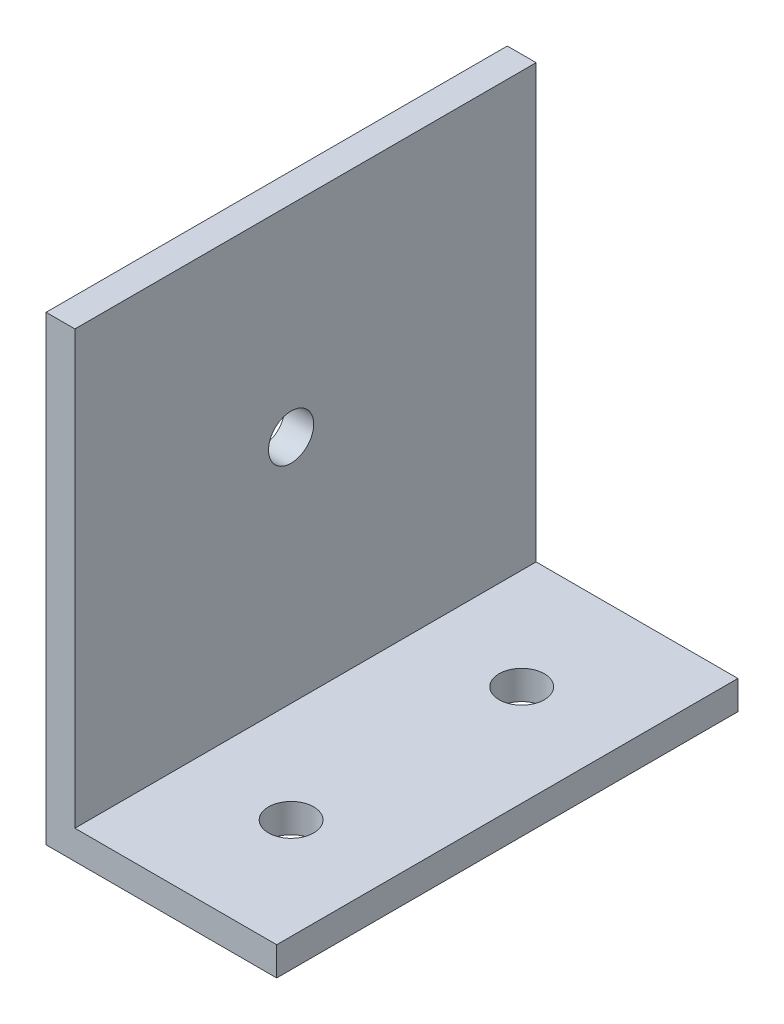
ISO-10303-21;
HEADER;
FILE_DESCRIPTION(('STEP AP214'),'2;1');
FILE_NAME('part.step','',(''),(''),'','','');
FILE_SCHEMA(('AUTOMOTIVE_DESIGN { 1 0 10303 214 1 1 1 1 }'));
ENDSEC;
DATA;
#1=APPLICATION_CONTEXT('core data for automotive mechanical design processes');
#2=APPLICATION_PROTOCOL_DEFINITION('international standard','automotive_design',2000,#1);
#3=PRODUCT_CONTEXT('',#1,'mechanical');
#4=PRODUCT('Part','Part','',(#3));
#5=PRODUCT_RELATED_PRODUCT_CATEGORY('part','',(#4));
#6=PRODUCT_DEFINITION_FORMATION('','',#4);
#7=PRODUCT_DEFINITION_CONTEXT('part definition',#1,'design');
#8=PRODUCT_DEFINITION('design','',#6,#7);
#9=PRODUCT_DEFINITION_SHAPE('','',#8);
#10=(LENGTH_UNIT() NAMED_UNIT(*) SI_UNIT(.MILLI.,.METRE.));
#11=(NAMED_UNIT(*) PLANE_ANGLE_UNIT() SI_UNIT($,.RADIAN.));
#12=(NAMED_UNIT(*) SI_UNIT($,.STERADIAN.) SOLID_ANGLE_UNIT());
#13=UNCERTAINTY_MEASURE_WITH_UNIT(LENGTH_MEASURE(1.E-05),#10,'distance_accuracy_value','');
#14=(GEOMETRIC_REPRESENTATION_CONTEXT(3) GLOBAL_UNCERTAINTY_ASSIGNED_CONTEXT((#13)) GLOBAL_UNIT_ASSIGNED_CONTEXT((#10,
#11,#12)) REPRESENTATION_CONTEXT('',''));
#15=CARTESIAN_POINT('',(0.,0.,0.));
#16=DIRECTION('',(0.,0.,1.));
#17=DIRECTION('',(1.,0.,0.));
#18=AXIS2_PLACEMENT_3D('',#15,#16,#17);
#19=CARTESIAN_POINT('',(25.4,0.,50.8));
#20=DIRECTION('',(0.,1.,0.));
#21=DIRECTION('',(-1.,0.,0.));
#22=AXIS2_PLACEMENT_3D('',#19,#20,#21);
#23=PLANE('',#22);
#24=CARTESIAN_POINT('',(14.2875,0.,38.1));
#25=DIRECTION('',(0.,1.,0.));
#26=DIRECTION('',(0.,0.,1.));
#27=AXIS2_PLACEMENT_3D('',#24,#25,#26);
#28=CIRCLE('',#27,2.4892);
#29=CARTESIAN_POINT('',(14.2875,0.,40.5892));
#30=VERTEX_POINT('',#29);
#31=EDGE_CURVE('E165',#30,#30,#28,.T.);
#32=ORIENTED_EDGE('',*,*,#31,.T.);
#33=EDGE_LOOP('',(#32));
#34=FACE_BOUND('',#33,.T.);
#35=CARTESIAN_POINT('',(14.2875,0.,12.7));
#36=DIRECTION('',(0.,1.,0.));
#37=DIRECTION('',(0.,0.,1.));
#38=AXIS2_PLACEMENT_3D('',#35,#36,#37);
#39=CIRCLE('',#38,2.4892);
#40=CARTESIAN_POINT('',(14.2875,0.,15.1892));
#41=VERTEX_POINT('',#40);
#42=EDGE_CURVE('E173',#41,#41,#39,.T.);
#43=ORIENTED_EDGE('',*,*,#42,.T.);
#44=EDGE_LOOP('',(#43));
#45=FACE_BOUND('',#44,.T.);
#46=DIRECTION('',(1.,0.,0.));
#47=VECTOR('',#46,1.);
#48=CARTESIAN_POINT('',(25.4,0.,0.));
#49=LINE('',#48,#47);
#50=CARTESIAN_POINT('',(0.,0.,0.));
#51=VERTEX_POINT('',#50);
#52=CARTESIAN_POINT('',(25.4,0.,0.));
#53=VERTEX_POINT('',#52);
#54=EDGE_CURVE('E136',#51,#53,#49,.T.);
#55=ORIENTED_EDGE('',*,*,#54,.T.);
#56=DIRECTION('',(0.,0.,-1.));
#57=VECTOR('',#56,1.);
#58=CARTESIAN_POINT('',(25.4,0.,50.8));
#59=LINE('',#58,#57);
#60=CARTESIAN_POINT('',(25.4,0.,50.8));
#61=VERTEX_POINT('',#60);
#62=EDGE_CURVE('E11',#61,#53,#59,.T.);
#63=ORIENTED_EDGE('',*,*,#62,.F.);
#64=DIRECTION('',(1.,0.,0.));
#65=VECTOR('',#64,1.);
#66=CARTESIAN_POINT('',(25.4,0.,50.8));
#67=LINE('',#66,#65);
#68=CARTESIAN_POINT('',(0.,0.,50.8));
#69=VERTEX_POINT('',#68);
#70=EDGE_CURVE('E153',#69,#61,#67,.T.);
#71=ORIENTED_EDGE('',*,*,#70,.F.);
#72=DIRECTION('',(0.,0.,-1.));
#73=VECTOR('',#72,1.);
#74=CARTESIAN_POINT('',(0.,0.,50.8));
#75=LINE('',#74,#73);
#76=EDGE_CURVE('E132',#69,#51,#75,.T.);
#77=ORIENTED_EDGE('',*,*,#76,.T.);
#78=EDGE_LOOP('',(#55,#63,#71,#77));
#79=FACE_BOUND('',#78,.T.);
#80=ADVANCED_FACE('F45',(#34,#45,#79),#23,.F.);
#81=CARTESIAN_POINT('',(25.4,3.175,50.8));
#82=DIRECTION('',(-1.,0.,0.));
#83=DIRECTION('',(0.,0.,1.));
#84=AXIS2_PLACEMENT_3D('',#81,#82,#83);
#85=PLANE('',#84);
#86=DIRECTION('',(0.,1.,0.));
#87=VECTOR('',#86,1.);
#88=CARTESIAN_POINT('',(25.4,3.175,0.));
#89=LINE('',#88,#87);
#90=CARTESIAN_POINT('',(25.4,3.175,0.));
#91=VERTEX_POINT('',#90);
#92=EDGE_CURVE('E140',#53,#91,#89,.T.);
#93=ORIENTED_EDGE('',*,*,#92,.T.);
#94=DIRECTION('',(0.,0.,-1.));
#95=VECTOR('',#94,1.);
#96=CARTESIAN_POINT('',(25.4,3.175,50.8));
#97=LINE('',#96,#95);
#98=CARTESIAN_POINT('',(25.4,3.175,50.8));
#99=VERTEX_POINT('',#98);
#100=EDGE_CURVE('E55',#99,#91,#97,.T.);
#101=ORIENTED_EDGE('',*,*,#100,.F.);
#102=DIRECTION('',(0.,1.,0.));
#103=VECTOR('',#102,1.);
#104=CARTESIAN_POINT('',(25.4,3.175,50.8));
#105=LINE('',#104,#103);
#106=EDGE_CURVE('E101',#61,#99,#105,.T.);
#107=ORIENTED_EDGE('',*,*,#106,.F.);
#108=ORIENTED_EDGE('',*,*,#62,.T.);
#109=EDGE_LOOP('',(#93,#101,#107,#108));
#110=FACE_BOUND('',#109,.T.);
#111=ADVANCED_FACE('F193',(#110),#85,.F.);
#112=CARTESIAN_POINT('',(3.175,3.175,50.8));
#113=DIRECTION('',(0.,-1.,0.));
#114=DIRECTION('',(0.,0.,-1.));
#115=AXIS2_PLACEMENT_3D('',#112,#113,#114);
#116=PLANE('',#115);
#117=CARTESIAN_POINT('',(14.2875,3.175,38.1));
#118=DIRECTION('',(0.,-1.,0.));
#119=DIRECTION('',(0.,0.,-1.));
#120=AXIS2_PLACEMENT_3D('',#117,#118,#119);
#121=CIRCLE('',#120,2.4892);
#122=CARTESIAN_POINT('',(14.2875,3.175,35.6108));
#123=VERTEX_POINT('',#122);
#124=EDGE_CURVE('E48',#123,#123,#121,.F.);
#125=ORIENTED_EDGE('',*,*,#124,.F.);
#126=EDGE_LOOP('',(#125));
#127=FACE_BOUND('',#126,.T.);
#128=CARTESIAN_POINT('',(14.2875,3.175,12.7));
#129=DIRECTION('',(0.,-1.,0.));
#130=DIRECTION('',(0.,0.,-1.));
#131=AXIS2_PLACEMENT_3D('',#128,#129,#130);
#132=CIRCLE('',#131,2.4892);
#133=CARTESIAN_POINT('',(14.2875,3.175,10.2108));
#134=VERTEX_POINT('',#133);
#135=EDGE_CURVE('E162',#134,#134,#132,.F.);
#136=ORIENTED_EDGE('',*,*,#135,.F.);
#137=EDGE_LOOP('',(#136));
#138=FACE_BOUND('',#137,.T.);
#139=DIRECTION('',(-1.,0.,0.));
#140=VECTOR('',#139,1.);
#141=CARTESIAN_POINT('',(3.175,3.175,0.));
#142=LINE('',#141,#140);
#143=CARTESIAN_POINT('',(3.175,3.175,0.));
#144=VERTEX_POINT('',#143);
#145=EDGE_CURVE('E144',#91,#144,#142,.T.);
#146=ORIENTED_EDGE('',*,*,#145,.T.);
#147=DIRECTION('',(0.,0.,-1.));
#148=VECTOR('',#147,1.);
#149=CARTESIAN_POINT('',(3.175,3.175,50.8));
#150=LINE('',#149,#148);
#151=CARTESIAN_POINT('',(3.175,3.175,50.8));
#152=VERTEX_POINT('',#151);
#153=EDGE_CURVE('E125',#152,#144,#150,.T.);
#154=ORIENTED_EDGE('',*,*,#153,.F.);
#155=DIRECTION('',(-1.,0.,0.));
#156=VECTOR('',#155,1.);
#157=CARTESIAN_POINT('',(3.175,3.175,50.8));
#158=LINE('',#157,#156);
#159=EDGE_CURVE('E114',#99,#152,#158,.T.);
#160=ORIENTED_EDGE('',*,*,#159,.F.);
#161=ORIENTED_EDGE('',*,*,#100,.T.);
#162=EDGE_LOOP('',(#146,#154,#160,#161));
#163=FACE_BOUND('',#162,.T.);
#164=ADVANCED_FACE('F196',(#127,#138,#163),#116,.F.);
#165=CARTESIAN_POINT('',(3.175,50.8,50.8));
#166=DIRECTION('',(-1.,0.,0.));
#167=DIRECTION('',(0.,-1.,0.));
#168=AXIS2_PLACEMENT_3D('',#165,#166,#167);
#169=PLANE('',#168);
#170=CARTESIAN_POINT('',(3.175,28.575,26.9875));
#171=DIRECTION('',(-1.,0.,0.));
#172=DIRECTION('',(0.,-1.,0.));
#173=AXIS2_PLACEMENT_3D('',#170,#171,#172);
#174=CIRCLE('',#173,2.4892);
#175=CARTESIAN_POINT('',(3.175,26.0858,26.9875));
#176=VERTEX_POINT('',#175);
#177=EDGE_CURVE('E141',#176,#176,#174,.F.);
#178=ORIENTED_EDGE('',*,*,#177,.F.);
#179=EDGE_LOOP('',(#178));
#180=FACE_BOUND('',#179,.T.);
#181=DIRECTION('',(0.,1.,0.));
#182=VECTOR('',#181,1.);
#183=CARTESIAN_POINT('',(3.175,50.8,0.));
#184=LINE('',#183,#182);
#185=CARTESIAN_POINT('',(3.175,50.8,0.));
#186=VERTEX_POINT('',#185);
#187=EDGE_CURVE('E123',#144,#186,#184,.T.);
#188=ORIENTED_EDGE('',*,*,#187,.T.);
#189=DIRECTION('',(0.,0.,-1.));
#190=VECTOR('',#189,1.);
#191=CARTESIAN_POINT('',(3.175,50.8,50.8));
#192=LINE('',#191,#190);
#193=CARTESIAN_POINT('',(3.175,50.8,50.8));
#194=VERTEX_POINT('',#193);
#195=EDGE_CURVE('E120',#194,#186,#192,.T.);
#196=ORIENTED_EDGE('',*,*,#195,.F.);
#197=DIRECTION('',(0.,1.,0.));
#198=VECTOR('',#197,1.);
#199=CARTESIAN_POINT('',(3.175,50.8,50.8));
#200=LINE('',#199,#198);
#201=EDGE_CURVE('E108',#152,#194,#200,.T.);
#202=ORIENTED_EDGE('',*,*,#201,.F.);
#203=ORIENTED_EDGE('',*,*,#153,.T.);
#204=EDGE_LOOP('',(#188,#196,#202,#203));
#205=FACE_BOUND('',#204,.T.);
#206=ADVANCED_FACE('F121',(#180,#205),#169,.F.);
#207=CARTESIAN_POINT('',(0.,50.8,50.8));
#208=DIRECTION('',(0.,-1.,0.));
#209=DIRECTION('',(0.,0.,-1.));
#210=AXIS2_PLACEMENT_3D('',#207,#208,#209);
#211=PLANE('',#210);
#212=DIRECTION('',(-1.,0.,0.));
#213=VECTOR('',#212,1.);
#214=CARTESIAN_POINT('',(0.,50.8,0.));
#215=LINE('',#214,#213);
#216=CARTESIAN_POINT('',(0.,50.8,0.));
#217=VERTEX_POINT('',#216);
#218=EDGE_CURVE('E87',#186,#217,#215,.T.);
#219=ORIENTED_EDGE('',*,*,#218,.T.);
#220=DIRECTION('',(0.,0.,-1.));
#221=VECTOR('',#220,1.);
#222=CARTESIAN_POINT('',(0.,50.8,50.8));
#223=LINE('',#222,#221);
#224=CARTESIAN_POINT('',(0.,50.8,50.8));
#225=VERTEX_POINT('',#224);
#226=EDGE_CURVE('E126',#225,#217,#223,.T.);
#227=ORIENTED_EDGE('',*,*,#226,.F.);
#228=DIRECTION('',(-1.,0.,0.));
#229=VECTOR('',#228,1.);
#230=CARTESIAN_POINT('',(0.,50.8,50.8));
#231=LINE('',#230,#229);
#232=EDGE_CURVE('E112',#194,#225,#231,.T.);
#233=ORIENTED_EDGE('',*,*,#232,.F.);
#234=ORIENTED_EDGE('',*,*,#195,.T.);
#235=EDGE_LOOP('',(#219,#227,#233,#234));
#236=FACE_BOUND('',#235,.T.);
#237=ADVANCED_FACE('F128',(#236),#211,.F.);
#238=CARTESIAN_POINT('',(0.,0.,50.8));
#239=DIRECTION('',(1.,0.,0.));
#240=DIRECTION('',(0.,0.,-1.));
#241=AXIS2_PLACEMENT_3D('',#238,#239,#240);
#242=PLANE('',#241);
#243=CARTESIAN_POINT('',(0.,28.575,26.9875));
#244=DIRECTION('',(1.,0.,0.));
#245=DIRECTION('',(0.,0.,-1.));
#246=AXIS2_PLACEMENT_3D('',#243,#244,#245);
#247=CIRCLE('',#246,2.4892);
#248=CARTESIAN_POINT('',(0.,28.575,24.4983));
#249=VERTEX_POINT('',#248);
#250=EDGE_CURVE('E171',#249,#249,#247,.T.);
#251=ORIENTED_EDGE('',*,*,#250,.T.);
#252=EDGE_LOOP('',(#251));
#253=FACE_BOUND('',#252,.T.);
#254=DIRECTION('',(0.,-1.,0.));
#255=VECTOR('',#254,1.);
#256=CARTESIAN_POINT('',(0.,0.,0.));
#257=LINE('',#256,#255);
#258=EDGE_CURVE('E93',#217,#51,#257,.T.);
#259=ORIENTED_EDGE('',*,*,#258,.T.);
#260=ORIENTED_EDGE('',*,*,#76,.F.);
#261=DIRECTION('',(0.,-1.,0.));
#262=VECTOR('',#261,1.);
#263=CARTESIAN_POINT('',(0.,0.,50.8));
#264=LINE('',#263,#262);
#265=EDGE_CURVE('E64',#225,#69,#264,.T.);
#266=ORIENTED_EDGE('',*,*,#265,.F.);
#267=ORIENTED_EDGE('',*,*,#226,.T.);
#268=EDGE_LOOP('',(#259,#260,#266,#267));
#269=FACE_BOUND('',#268,.T.);
#270=ADVANCED_FACE('F201',(#253,#269),#242,.F.);
#271=CARTESIAN_POINT('',(0.,0.,50.8));
#272=DIRECTION('',(0.,0.,-1.));
#273=DIRECTION('',(-1.,0.,0.));
#274=AXIS2_PLACEMENT_3D('',#271,#272,#273);
#275=PLANE('',#274);
#276=ORIENTED_EDGE('',*,*,#70,.T.);
#277=ORIENTED_EDGE('',*,*,#106,.T.);
#278=ORIENTED_EDGE('',*,*,#159,.T.);
#279=ORIENTED_EDGE('',*,*,#201,.T.);
#280=ORIENTED_EDGE('',*,*,#232,.T.);
#281=ORIENTED_EDGE('',*,*,#265,.T.);
#282=EDGE_LOOP('',(#276,#277,#278,#279,#280,#281));
#283=FACE_BOUND('',#282,.T.);
#284=ADVANCED_FACE('F110',(#283),#275,.F.);
#285=CARTESIAN_POINT('',(0.,0.,0.));
#286=DIRECTION('',(0.,0.,-1.));
#287=DIRECTION('',(-1.,0.,0.));
#288=AXIS2_PLACEMENT_3D('',#285,#286,#287);
#289=PLANE('',#288);
#290=ORIENTED_EDGE('',*,*,#54,.F.);
#291=ORIENTED_EDGE('',*,*,#258,.F.);
#292=ORIENTED_EDGE('',*,*,#218,.F.);
#293=ORIENTED_EDGE('',*,*,#187,.F.);
#294=ORIENTED_EDGE('',*,*,#145,.F.);
#295=ORIENTED_EDGE('',*,*,#92,.F.);
#296=EDGE_LOOP('',(#290,#291,#292,#293,#294,#295));
#297=FACE_BOUND('',#296,.T.);
#298=ADVANCED_FACE('F199',(#297),#289,.T.);
#299=CARTESIAN_POINT('',(25.4,28.575,26.9875));
#300=DIRECTION('',(-1.,0.,0.));
#301=DIRECTION('',(0.,0.,1.));
#302=AXIS2_PLACEMENT_3D('',#299,#300,#301);
#303=CYLINDRICAL_SURFACE('',#302,2.4892);
#304=ORIENTED_EDGE('',*,*,#250,.F.);
#305=EDGE_LOOP('',(#304));
#306=FACE_BOUND('',#305,.T.);
#307=ORIENTED_EDGE('',*,*,#177,.T.);
#308=EDGE_LOOP('',(#307));
#309=FACE_BOUND('',#308,.T.);
#310=ADVANCED_FACE('F225',(#306,#309),#303,.F.);
#311=CARTESIAN_POINT('',(14.2875,50.8,12.7));
#312=DIRECTION('',(0.,-1.,0.));
#313=DIRECTION('',(0.,0.,-1.));
#314=AXIS2_PLACEMENT_3D('',#311,#312,#313);
#315=CYLINDRICAL_SURFACE('',#314,2.4892);
#316=ORIENTED_EDGE('',*,*,#42,.F.);
#317=EDGE_LOOP('',(#316));
#318=FACE_BOUND('',#317,.T.);
#319=ORIENTED_EDGE('',*,*,#135,.T.);
#320=EDGE_LOOP('',(#319));
#321=FACE_BOUND('',#320,.T.);
#322=ADVANCED_FACE('F222',(#318,#321),#315,.F.);
#323=CARTESIAN_POINT('',(14.2875,50.8,38.1));
#324=DIRECTION('',(0.,-1.,0.));
#325=DIRECTION('',(0.,0.,-1.));
#326=AXIS2_PLACEMENT_3D('',#323,#324,#325);
#327=CYLINDRICAL_SURFACE('',#326,2.4892);
#328=ORIENTED_EDGE('',*,*,#31,.F.);
#329=EDGE_LOOP('',(#328));
#330=FACE_BOUND('',#329,.T.);
#331=ORIENTED_EDGE('',*,*,#124,.T.);
#332=EDGE_LOOP('',(#331));
#333=FACE_BOUND('',#332,.T.);
#334=ADVANCED_FACE('F224',(#330,#333),#327,.F.);
#335=CLOSED_SHELL('',(#80,#111,#164,#206,#237,#270,#284,#298,#310,#322,#334));
#336=MANIFOLD_SOLID_BREP('B2',#335);
#337=ADVANCED_BREP_SHAPE_REPRESENTATION('',(#18,#336),#14);
#338=SHAPE_DEFINITION_REPRESENTATION(#9,#337);
ENDSEC;
END-ISO-10303-21;
